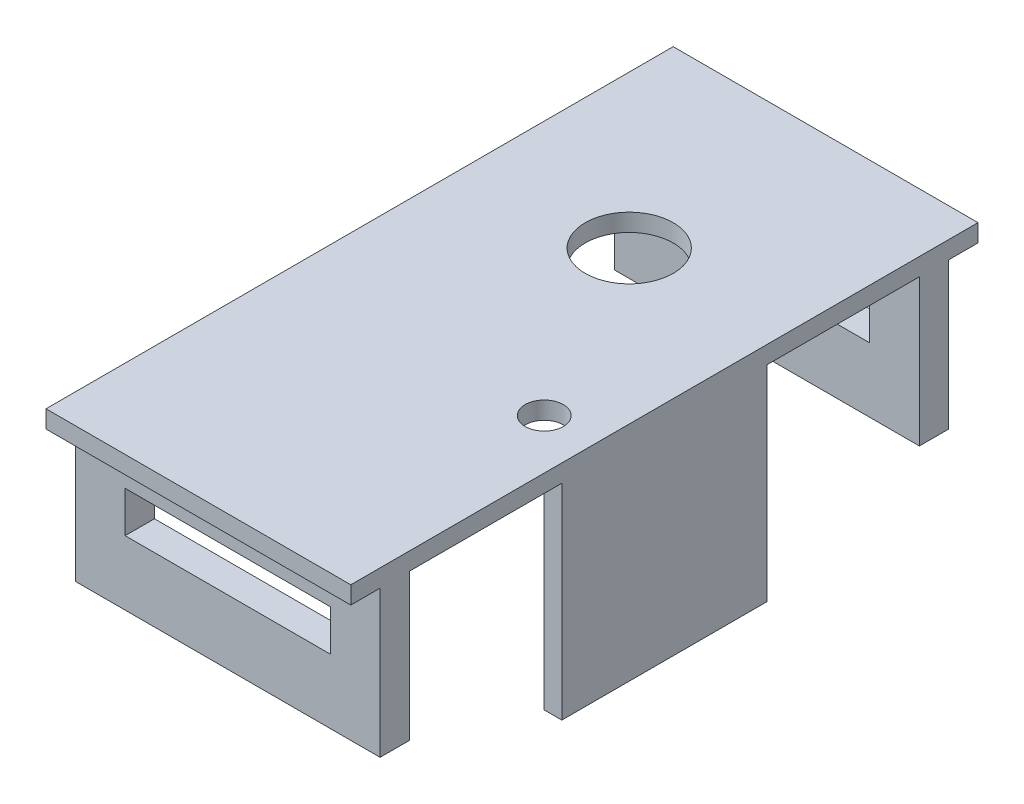
ISO-10303-21;
HEADER;
FILE_DESCRIPTION(('STEP AP214'),'2;1');
FILE_NAME('part.step','',(''),(''),'','','');
FILE_SCHEMA(('AUTOMOTIVE_DESIGN { 1 0 10303 214 1 1 1 1 }'));
ENDSEC;
DATA;
#1=APPLICATION_CONTEXT('core data for automotive mechanical design processes');
#2=APPLICATION_PROTOCOL_DEFINITION('international standard','automotive_design',2000,#1);
#3=PRODUCT_CONTEXT('',#1,'mechanical');
#4=PRODUCT('Part','Part','',(#3));
#5=PRODUCT_RELATED_PRODUCT_CATEGORY('part','',(#4));
#6=PRODUCT_DEFINITION_FORMATION('','',#4);
#7=PRODUCT_DEFINITION_CONTEXT('part definition',#1,'design');
#8=PRODUCT_DEFINITION('design','',#6,#7);
#9=PRODUCT_DEFINITION_SHAPE('','',#8);
#10=(LENGTH_UNIT() NAMED_UNIT(*) SI_UNIT(.MILLI.,.METRE.));
#11=(NAMED_UNIT(*) PLANE_ANGLE_UNIT() SI_UNIT($,.RADIAN.));
#12=(NAMED_UNIT(*) SI_UNIT($,.STERADIAN.) SOLID_ANGLE_UNIT());
#13=UNCERTAINTY_MEASURE_WITH_UNIT(LENGTH_MEASURE(1.E-05),#10,'distance_accuracy_value','');
#14=(GEOMETRIC_REPRESENTATION_CONTEXT(3) GLOBAL_UNCERTAINTY_ASSIGNED_CONTEXT((#13)) GLOBAL_UNIT_ASSIGNED_CONTEXT((#10,
#11,#12)) REPRESENTATION_CONTEXT('',''));
#15=CARTESIAN_POINT('',(0.,0.,0.));
#16=DIRECTION('',(0.,0.,1.));
#17=DIRECTION('',(1.,0.,0.));
#18=AXIS2_PLACEMENT_3D('',#15,#16,#17);
#19=CARTESIAN_POINT('',(0.,0.,0.));
#20=DIRECTION('',(0.,1.,0.));
#21=DIRECTION('',(0.,0.,1.));
#22=AXIS2_PLACEMENT_3D('',#19,#20,#21);
#23=PLANE('',#22);
#24=CARTESIAN_POINT('',(0.,0.,-20.));
#25=DIRECTION('',(0.,1.,0.));
#26=DIRECTION('',(0.,0.,1.));
#27=AXIS2_PLACEMENT_3D('',#24,#25,#26);
#28=CIRCLE('',#27,7.5);
#29=CARTESIAN_POINT('',(0.,0.,-12.5));
#30=VERTEX_POINT('',#29);
#31=EDGE_CURVE('E278',#30,#30,#28,.T.);
#32=ORIENTED_EDGE('',*,*,#31,.T.);
#33=EDGE_LOOP('',(#32));
#34=FACE_BOUND('',#33,.T.);
#35=CARTESIAN_POINT('',(17.5,0.,12.));
#36=DIRECTION('',(0.,1.,0.));
#37=DIRECTION('',(0.,0.,1.));
#38=AXIS2_PLACEMENT_3D('',#35,#36,#37);
#39=CIRCLE('',#38,3.25);
#40=CARTESIAN_POINT('',(17.5,0.,15.25));
#41=VERTEX_POINT('',#40);
#42=EDGE_CURVE('E427',#41,#41,#39,.T.);
#43=ORIENTED_EDGE('',*,*,#42,.T.);
#44=EDGE_LOOP('',(#43));
#45=FACE_BOUND('',#44,.T.);
#46=DIRECTION('',(-1.,0.,0.));
#47=VECTOR('',#46,1.);
#48=CARTESIAN_POINT('',(26.,0.,-43.5));
#49=LINE('',#48,#47);
#50=CARTESIAN_POINT('',(26.,0.,-43.5));
#51=VERTEX_POINT('',#50);
#52=CARTESIAN_POINT('',(-26.,0.,-43.5));
#53=VERTEX_POINT('',#52);
#54=EDGE_CURVE('E282',#51,#53,#49,.T.);
#55=ORIENTED_EDGE('',*,*,#54,.F.);
#56=DIRECTION('',(0.,0.,-1.));
#57=VECTOR('',#56,1.);
#58=CARTESIAN_POINT('',(26.,0.,53.5));
#59=LINE('',#58,#57);
#60=CARTESIAN_POINT('',(26.,0.,-17.5));
#61=VERTEX_POINT('',#60);
#62=EDGE_CURVE('E466',#61,#51,#59,.T.);
#63=ORIENTED_EDGE('',*,*,#62,.F.);
#64=DIRECTION('',(1.,0.,0.));
#65=VECTOR('',#64,1.);
#66=CARTESIAN_POINT('',(26.,0.,-17.5));
#67=LINE('',#66,#65);
#68=CARTESIAN_POINT('',(23.,0.,-17.5));
#69=VERTEX_POINT('',#68);
#70=EDGE_CURVE('E354',#69,#61,#67,.T.);
#71=ORIENTED_EDGE('',*,*,#70,.F.);
#72=DIRECTION('',(0.,0.,-1.));
#73=VECTOR('',#72,1.);
#74=CARTESIAN_POINT('',(23.,0.,17.5));
#75=LINE('',#74,#73);
#76=CARTESIAN_POINT('',(23.,0.,17.5));
#77=VERTEX_POINT('',#76);
#78=EDGE_CURVE('E366',#77,#69,#75,.T.);
#79=ORIENTED_EDGE('',*,*,#78,.F.);
#80=DIRECTION('',(-1.,0.,0.));
#81=VECTOR('',#80,1.);
#82=CARTESIAN_POINT('',(26.,0.,17.5));
#83=LINE('',#82,#81);
#84=CARTESIAN_POINT('',(26.,0.,17.5));
#85=VERTEX_POINT('',#84);
#86=EDGE_CURVE('E348',#85,#77,#83,.T.);
#87=ORIENTED_EDGE('',*,*,#86,.F.);
#88=CARTESIAN_POINT('',(26.,0.,43.5));
#89=VERTEX_POINT('',#88);
#90=EDGE_CURVE('E465',#89,#85,#59,.T.);
#91=ORIENTED_EDGE('',*,*,#90,.F.);
#92=DIRECTION('',(1.,0.,0.));
#93=VECTOR('',#92,1.);
#94=CARTESIAN_POINT('',(-26.,0.,43.5));
#95=LINE('',#94,#93);
#96=CARTESIAN_POINT('',(-26.,0.,43.5));
#97=VERTEX_POINT('',#96);
#98=EDGE_CURVE('E315',#97,#89,#95,.T.);
#99=ORIENTED_EDGE('',*,*,#98,.F.);
#100=DIRECTION('',(0.,0.,1.));
#101=VECTOR('',#100,1.);
#102=CARTESIAN_POINT('',(-26.,0.,53.5));
#103=LINE('',#102,#101);
#104=CARTESIAN_POINT('',(-26.,0.,17.5));
#105=VERTEX_POINT('',#104);
#106=EDGE_CURVE('E457',#105,#97,#103,.T.);
#107=ORIENTED_EDGE('',*,*,#106,.F.);
#108=DIRECTION('',(-1.,0.,0.));
#109=VECTOR('',#108,1.);
#110=CARTESIAN_POINT('',(-26.,0.,17.5));
#111=LINE('',#110,#109);
#112=CARTESIAN_POINT('',(-23.,0.,17.5));
#113=VERTEX_POINT('',#112);
#114=EDGE_CURVE('E392',#113,#105,#111,.T.);
#115=ORIENTED_EDGE('',*,*,#114,.F.);
#116=DIRECTION('',(0.,0.,1.));
#117=VECTOR('',#116,1.);
#118=CARTESIAN_POINT('',(-23.,0.,17.5));
#119=LINE('',#118,#117);
#120=CARTESIAN_POINT('',(-23.,0.,-17.5));
#121=VERTEX_POINT('',#120);
#122=EDGE_CURVE('E405',#121,#113,#119,.T.);
#123=ORIENTED_EDGE('',*,*,#122,.F.);
#124=DIRECTION('',(1.,0.,0.));
#125=VECTOR('',#124,1.);
#126=CARTESIAN_POINT('',(-26.,0.,-17.5));
#127=LINE('',#126,#125);
#128=CARTESIAN_POINT('',(-26.,0.,-17.5));
#129=VERTEX_POINT('',#128);
#130=EDGE_CURVE('E386',#129,#121,#127,.T.);
#131=ORIENTED_EDGE('',*,*,#130,.F.);
#132=EDGE_CURVE('E456',#53,#129,#103,.T.);
#133=ORIENTED_EDGE('',*,*,#132,.F.);
#134=EDGE_LOOP('',(#55,#63,#71,#79,#87,#91,#99,#107,#115,#123,#131,#133));
#135=FACE_BOUND('',#134,.T.);
#136=ADVANCED_FACE('F39',(#34,#45,#135),#23,.F.);
#137=DIRECTION('',(1.,0.,0.));
#138=VECTOR('',#137,1.);
#139=CARTESIAN_POINT('',(26.,0.,-48.5));
#140=LINE('',#139,#138);
#141=CARTESIAN_POINT('',(-26.,0.,-48.5));
#142=VERTEX_POINT('',#141);
#143=CARTESIAN_POINT('',(26.,0.,-48.5));
#144=VERTEX_POINT('',#143);
#145=EDGE_CURVE('E288',#142,#144,#140,.T.);
#146=ORIENTED_EDGE('',*,*,#145,.F.);
#147=CARTESIAN_POINT('',(-26.,0.,-53.5));
#148=VERTEX_POINT('',#147);
#149=EDGE_CURVE('E451',#148,#142,#103,.T.);
#150=ORIENTED_EDGE('',*,*,#149,.F.);
#151=DIRECTION('',(-1.,0.,0.));
#152=VECTOR('',#151,1.);
#153=CARTESIAN_POINT('',(26.,0.,-53.5));
#154=LINE('',#153,#152);
#155=CARTESIAN_POINT('',(26.,0.,-53.5));
#156=VERTEX_POINT('',#155);
#157=EDGE_CURVE('E441',#156,#148,#154,.T.);
#158=ORIENTED_EDGE('',*,*,#157,.F.);
#159=EDGE_CURVE('E460',#144,#156,#59,.T.);
#160=ORIENTED_EDGE('',*,*,#159,.F.);
#161=EDGE_LOOP('',(#146,#150,#158,#160));
#162=FACE_BOUND('',#161,.T.);
#163=ADVANCED_FACE('F551',(#162),#23,.F.);
#164=DIRECTION('',(-1.,0.,0.));
#165=VECTOR('',#164,1.);
#166=CARTESIAN_POINT('',(-26.,0.,48.5));
#167=LINE('',#166,#165);
#168=CARTESIAN_POINT('',(26.,0.,48.5));
#169=VERTEX_POINT('',#168);
#170=CARTESIAN_POINT('',(-26.,0.,48.5));
#171=VERTEX_POINT('',#170);
#172=EDGE_CURVE('E321',#169,#171,#167,.T.);
#173=ORIENTED_EDGE('',*,*,#172,.F.);
#174=CARTESIAN_POINT('',(26.,0.,53.5));
#175=VERTEX_POINT('',#174);
#176=EDGE_CURVE('E461',#175,#169,#59,.T.);
#177=ORIENTED_EDGE('',*,*,#176,.F.);
#178=DIRECTION('',(1.,0.,0.));
#179=VECTOR('',#178,1.);
#180=CARTESIAN_POINT('',(26.,0.,53.5));
#181=LINE('',#180,#179);
#182=CARTESIAN_POINT('',(-26.,0.,53.5));
#183=VERTEX_POINT('',#182);
#184=EDGE_CURVE('E455',#183,#175,#181,.T.);
#185=ORIENTED_EDGE('',*,*,#184,.F.);
#186=EDGE_CURVE('E432',#171,#183,#103,.T.);
#187=ORIENTED_EDGE('',*,*,#186,.F.);
#188=EDGE_LOOP('',(#173,#177,#185,#187));
#189=FACE_BOUND('',#188,.T.);
#190=ADVANCED_FACE('F554',(#189),#23,.F.);
#191=CARTESIAN_POINT('',(0.,3.,0.));
#192=DIRECTION('',(0.,1.,0.));
#193=DIRECTION('',(0.,0.,1.));
#194=AXIS2_PLACEMENT_3D('',#191,#192,#193);
#195=PLANE('',#194);
#196=CARTESIAN_POINT('',(0.,3.,-20.));
#197=DIRECTION('',(0.,1.,0.));
#198=DIRECTION('',(0.,0.,1.));
#199=AXIS2_PLACEMENT_3D('',#196,#197,#198);
#200=CIRCLE('',#199,7.5);
#201=CARTESIAN_POINT('',(0.,3.,-12.5));
#202=VERTEX_POINT('',#201);
#203=EDGE_CURVE('E274',#202,#202,#200,.T.);
#204=ORIENTED_EDGE('',*,*,#203,.F.);
#205=EDGE_LOOP('',(#204));
#206=FACE_BOUND('',#205,.T.);
#207=DIRECTION('',(0.,0.,1.));
#208=VECTOR('',#207,1.);
#209=CARTESIAN_POINT('',(-26.,3.,53.5));
#210=LINE('',#209,#208);
#211=CARTESIAN_POINT('',(-26.,3.,-53.5));
#212=VERTEX_POINT('',#211);
#213=CARTESIAN_POINT('',(-26.,3.,53.5));
#214=VERTEX_POINT('',#213);
#215=EDGE_CURVE('E436',#212,#214,#210,.T.);
#216=ORIENTED_EDGE('',*,*,#215,.T.);
#217=DIRECTION('',(1.,0.,0.));
#218=VECTOR('',#217,1.);
#219=CARTESIAN_POINT('',(26.,3.,53.5));
#220=LINE('',#219,#218);
#221=CARTESIAN_POINT('',(26.,3.,53.5));
#222=VERTEX_POINT('',#221);
#223=EDGE_CURVE('E440',#214,#222,#220,.T.);
#224=ORIENTED_EDGE('',*,*,#223,.T.);
#225=DIRECTION('',(0.,0.,-1.));
#226=VECTOR('',#225,1.);
#227=CARTESIAN_POINT('',(26.,3.,53.5));
#228=LINE('',#227,#226);
#229=CARTESIAN_POINT('',(26.,3.,-53.5));
#230=VERTEX_POINT('',#229);
#231=EDGE_CURVE('E444',#222,#230,#228,.T.);
#232=ORIENTED_EDGE('',*,*,#231,.T.);
#233=DIRECTION('',(-1.,0.,0.));
#234=VECTOR('',#233,1.);
#235=CARTESIAN_POINT('',(26.,3.,-53.5));
#236=LINE('',#235,#234);
#237=EDGE_CURVE('E447',#230,#212,#236,.T.);
#238=ORIENTED_EDGE('',*,*,#237,.T.);
#239=EDGE_LOOP('',(#216,#224,#232,#238));
#240=FACE_BOUND('',#239,.T.);
#241=CARTESIAN_POINT('',(17.5,3.,12.));
#242=DIRECTION('',(0.,1.,0.));
#243=DIRECTION('',(0.,0.,1.));
#244=AXIS2_PLACEMENT_3D('',#241,#242,#243);
#245=CIRCLE('',#244,3.25);
#246=CARTESIAN_POINT('',(17.5,3.,15.25));
#247=VERTEX_POINT('',#246);
#248=EDGE_CURVE('E428',#247,#247,#245,.T.);
#249=ORIENTED_EDGE('',*,*,#248,.F.);
#250=EDGE_LOOP('',(#249));
#251=FACE_BOUND('',#250,.T.);
#252=ADVANCED_FACE('F563',(#206,#240,#251),#195,.T.);
#253=CARTESIAN_POINT('',(-26.,3.,53.5));
#254=DIRECTION('',(1.,0.,0.));
#255=DIRECTION('',(0.,0.,-1.));
#256=AXIS2_PLACEMENT_3D('',#253,#254,#255);
#257=PLANE('',#256);
#258=ORIENTED_EDGE('',*,*,#149,.T.);
#259=DIRECTION('',(0.,1.,0.));
#260=VECTOR('',#259,1.);
#261=CARTESIAN_POINT('',(-26.,-25.,-48.5));
#262=LINE('',#261,#260);
#263=CARTESIAN_POINT('',(-26.,-25.,-48.5));
#264=VERTEX_POINT('',#263);
#265=EDGE_CURVE('E305',#264,#142,#262,.T.);
#266=ORIENTED_EDGE('',*,*,#265,.F.);
#267=DIRECTION('',(0.,0.,-1.));
#268=VECTOR('',#267,1.);
#269=CARTESIAN_POINT('',(-26.,-25.,-43.5));
#270=LINE('',#269,#268);
#271=CARTESIAN_POINT('',(-26.,-25.,-43.5));
#272=VERTEX_POINT('',#271);
#273=EDGE_CURVE('E291',#272,#264,#270,.T.);
#274=ORIENTED_EDGE('',*,*,#273,.F.);
#275=DIRECTION('',(0.,1.,0.));
#276=VECTOR('',#275,1.);
#277=CARTESIAN_POINT('',(-26.,-25.,-43.5));
#278=LINE('',#277,#276);
#279=EDGE_CURVE('E308',#272,#53,#278,.T.);
#280=ORIENTED_EDGE('',*,*,#279,.T.);
#281=ORIENTED_EDGE('',*,*,#132,.T.);
#282=DIRECTION('',(0.,1.,0.));
#283=VECTOR('',#282,1.);
#284=CARTESIAN_POINT('',(-26.,-35.,-17.5));
#285=LINE('',#284,#283);
#286=CARTESIAN_POINT('',(-26.,-35.,-17.5));
#287=VERTEX_POINT('',#286);
#288=EDGE_CURVE('E423',#287,#129,#285,.T.);
#289=ORIENTED_EDGE('',*,*,#288,.F.);
#290=DIRECTION('',(0.,0.,-1.));
#291=VECTOR('',#290,1.);
#292=CARTESIAN_POINT('',(-26.,-35.,17.5));
#293=LINE('',#292,#291);
#294=CARTESIAN_POINT('',(-26.,-35.,17.5));
#295=VERTEX_POINT('',#294);
#296=EDGE_CURVE('E387',#295,#287,#293,.T.);
#297=ORIENTED_EDGE('',*,*,#296,.F.);
#298=DIRECTION('',(0.,1.,0.));
#299=VECTOR('',#298,1.);
#300=CARTESIAN_POINT('',(-26.,-35.,17.5));
#301=LINE('',#300,#299);
#302=EDGE_CURVE('E401',#295,#105,#301,.T.);
#303=ORIENTED_EDGE('',*,*,#302,.T.);
#304=ORIENTED_EDGE('',*,*,#106,.T.);
#305=DIRECTION('',(0.,1.,0.));
#306=VECTOR('',#305,1.);
#307=CARTESIAN_POINT('',(-26.,-25.,43.5));
#308=LINE('',#307,#306);
#309=CARTESIAN_POINT('',(-26.,-25.,43.5));
#310=VERTEX_POINT('',#309);
#311=EDGE_CURVE('E345',#310,#97,#308,.T.);
#312=ORIENTED_EDGE('',*,*,#311,.F.);
#313=DIRECTION('',(0.,0.,-1.));
#314=VECTOR('',#313,1.);
#315=CARTESIAN_POINT('',(-26.,-25.,48.5));
#316=LINE('',#315,#314);
#317=CARTESIAN_POINT('',(-26.,-25.,48.5));
#318=VERTEX_POINT('',#317);
#319=EDGE_CURVE('E316',#318,#310,#316,.T.);
#320=ORIENTED_EDGE('',*,*,#319,.F.);
#321=DIRECTION('',(0.,1.,0.));
#322=VECTOR('',#321,1.);
#323=CARTESIAN_POINT('',(-26.,-25.,48.5));
#324=LINE('',#323,#322);
#325=EDGE_CURVE('E330',#318,#171,#324,.T.);
#326=ORIENTED_EDGE('',*,*,#325,.T.);
#327=ORIENTED_EDGE('',*,*,#186,.T.);
#328=DIRECTION('',(0.,-1.,0.));
#329=VECTOR('',#328,1.);
#330=CARTESIAN_POINT('',(-26.,3.,53.5));
#331=LINE('',#330,#329);
#332=EDGE_CURVE('E480',#214,#183,#331,.T.);
#333=ORIENTED_EDGE('',*,*,#332,.F.);
#334=ORIENTED_EDGE('',*,*,#215,.F.);
#335=DIRECTION('',(0.,-1.,0.));
#336=VECTOR('',#335,1.);
#337=CARTESIAN_POINT('',(-26.,3.,-53.5));
#338=LINE('',#337,#336);
#339=EDGE_CURVE('E450',#212,#148,#338,.T.);
#340=ORIENTED_EDGE('',*,*,#339,.T.);
#341=EDGE_LOOP('',(#258,#266,#274,#280,#281,#289,#297,#303,#304,#312,#320,#326,#327,#333,#334,#340));
#342=FACE_BOUND('',#341,.T.);
#343=ADVANCED_FACE('F41',(#342),#257,.F.);
#344=CARTESIAN_POINT('',(26.,3.,53.5));
#345=DIRECTION('',(0.,0.,-1.));
#346=DIRECTION('',(-1.,0.,0.));
#347=AXIS2_PLACEMENT_3D('',#344,#345,#346);
#348=PLANE('',#347);
#349=ORIENTED_EDGE('',*,*,#184,.T.);
#350=DIRECTION('',(0.,-1.,0.));
#351=VECTOR('',#350,1.);
#352=CARTESIAN_POINT('',(26.,3.,53.5));
#353=LINE('',#352,#351);
#354=EDGE_CURVE('E476',#222,#175,#353,.T.);
#355=ORIENTED_EDGE('',*,*,#354,.F.);
#356=ORIENTED_EDGE('',*,*,#223,.F.);
#357=ORIENTED_EDGE('',*,*,#332,.T.);
#358=EDGE_LOOP('',(#349,#355,#356,#357));
#359=FACE_BOUND('',#358,.T.);
#360=ADVANCED_FACE('F584',(#359),#348,.F.);
#361=CARTESIAN_POINT('',(26.,3.,53.5));
#362=DIRECTION('',(-1.,0.,0.));
#363=DIRECTION('',(0.,0.,1.));
#364=AXIS2_PLACEMENT_3D('',#361,#362,#363);
#365=PLANE('',#364);
#366=ORIENTED_EDGE('',*,*,#176,.T.);
#367=DIRECTION('',(0.,1.,0.));
#368=VECTOR('',#367,1.);
#369=CARTESIAN_POINT('',(26.,-25.,48.5));
#370=LINE('',#369,#368);
#371=CARTESIAN_POINT('',(26.,-25.,48.5));
#372=VERTEX_POINT('',#371);
#373=EDGE_CURVE('E339',#372,#169,#370,.T.);
#374=ORIENTED_EDGE('',*,*,#373,.F.);
#375=DIRECTION('',(0.,0.,1.));
#376=VECTOR('',#375,1.);
#377=CARTESIAN_POINT('',(26.,-25.,48.5));
#378=LINE('',#377,#376);
#379=CARTESIAN_POINT('',(26.,-25.,43.5));
#380=VERTEX_POINT('',#379);
#381=EDGE_CURVE('E324',#380,#372,#378,.T.);
#382=ORIENTED_EDGE('',*,*,#381,.F.);
#383=DIRECTION('',(0.,1.,0.));
#384=VECTOR('',#383,1.);
#385=CARTESIAN_POINT('',(26.,-25.,43.5));
#386=LINE('',#385,#384);
#387=EDGE_CURVE('E342',#380,#89,#386,.T.);
#388=ORIENTED_EDGE('',*,*,#387,.T.);
#389=ORIENTED_EDGE('',*,*,#90,.T.);
#390=DIRECTION('',(0.,1.,0.));
#391=VECTOR('',#390,1.);
#392=CARTESIAN_POINT('',(26.,-35.,17.5));
#393=LINE('',#392,#391);
#394=CARTESIAN_POINT('',(26.,-35.,17.5));
#395=VERTEX_POINT('',#394);
#396=EDGE_CURVE('E382',#395,#85,#393,.T.);
#397=ORIENTED_EDGE('',*,*,#396,.F.);
#398=DIRECTION('',(0.,0.,1.));
#399=VECTOR('',#398,1.);
#400=CARTESIAN_POINT('',(26.,-35.,17.5));
#401=LINE('',#400,#399);
#402=CARTESIAN_POINT('',(26.,-35.,-17.5));
#403=VERTEX_POINT('',#402);
#404=EDGE_CURVE('E349',#403,#395,#401,.T.);
#405=ORIENTED_EDGE('',*,*,#404,.F.);
#406=DIRECTION('',(0.,1.,0.));
#407=VECTOR('',#406,1.);
#408=CARTESIAN_POINT('',(26.,-35.,-17.5));
#409=LINE('',#408,#407);
#410=EDGE_CURVE('E363',#403,#61,#409,.T.);
#411=ORIENTED_EDGE('',*,*,#410,.T.);
#412=ORIENTED_EDGE('',*,*,#62,.T.);
#413=DIRECTION('',(0.,1.,0.));
#414=VECTOR('',#413,1.);
#415=CARTESIAN_POINT('',(26.,-25.,-43.5));
#416=LINE('',#415,#414);
#417=CARTESIAN_POINT('',(26.,-25.,-43.5));
#418=VERTEX_POINT('',#417);
#419=EDGE_CURVE('E312',#418,#51,#416,.T.);
#420=ORIENTED_EDGE('',*,*,#419,.F.);
#421=DIRECTION('',(0.,0.,1.));
#422=VECTOR('',#421,1.);
#423=CARTESIAN_POINT('',(26.,-25.,-43.5));
#424=LINE('',#423,#422);
#425=CARTESIAN_POINT('',(26.,-25.,-48.5));
#426=VERTEX_POINT('',#425);
#427=EDGE_CURVE('E283',#426,#418,#424,.T.);
#428=ORIENTED_EDGE('',*,*,#427,.F.);
#429=DIRECTION('',(0.,1.,0.));
#430=VECTOR('',#429,1.);
#431=CARTESIAN_POINT('',(26.,-25.,-48.5));
#432=LINE('',#431,#430);
#433=EDGE_CURVE('E297',#426,#144,#432,.T.);
#434=ORIENTED_EDGE('',*,*,#433,.T.);
#435=ORIENTED_EDGE('',*,*,#159,.T.);
#436=DIRECTION('',(0.,-1.,0.));
#437=VECTOR('',#436,1.);
#438=CARTESIAN_POINT('',(26.,3.,-53.5));
#439=LINE('',#438,#437);
#440=EDGE_CURVE('E472',#230,#156,#439,.T.);
#441=ORIENTED_EDGE('',*,*,#440,.F.);
#442=ORIENTED_EDGE('',*,*,#231,.F.);
#443=ORIENTED_EDGE('',*,*,#354,.T.);
#444=EDGE_LOOP('',(#366,#374,#382,#388,#389,#397,#405,#411,#412,#420,#428,#434,#435,#441,#442,#443));
#445=FACE_BOUND('',#444,.T.);
#446=ADVANCED_FACE('F577',(#445),#365,.F.);
#447=CARTESIAN_POINT('',(26.,3.,-53.5));
#448=DIRECTION('',(0.,0.,1.));
#449=DIRECTION('',(1.,0.,0.));
#450=AXIS2_PLACEMENT_3D('',#447,#448,#449);
#451=PLANE('',#450);
#452=ORIENTED_EDGE('',*,*,#157,.T.);
#453=ORIENTED_EDGE('',*,*,#339,.F.);
#454=ORIENTED_EDGE('',*,*,#237,.F.);
#455=ORIENTED_EDGE('',*,*,#440,.T.);
#456=EDGE_LOOP('',(#452,#453,#454,#455));
#457=FACE_BOUND('',#456,.T.);
#458=ADVANCED_FACE('F628',(#457),#451,.F.);
#459=CARTESIAN_POINT('',(17.5,3.,12.));
#460=DIRECTION('',(0.,-1.,0.));
#461=DIRECTION('',(0.,0.,-1.));
#462=AXIS2_PLACEMENT_3D('',#459,#460,#461);
#463=CYLINDRICAL_SURFACE('',#462,3.25);
#464=ORIENTED_EDGE('',*,*,#248,.T.);
#465=EDGE_LOOP('',(#464));
#466=FACE_BOUND('',#465,.T.);
#467=ORIENTED_EDGE('',*,*,#42,.F.);
#468=EDGE_LOOP('',(#467));
#469=FACE_BOUND('',#468,.T.);
#470=ADVANCED_FACE('F623',(#466,#469),#463,.F.);
#471=CARTESIAN_POINT('',(-26.,-35.,-17.5));
#472=DIRECTION('',(0.,0.,1.));
#473=DIRECTION('',(1.,0.,0.));
#474=AXIS2_PLACEMENT_3D('',#471,#472,#473);
#475=PLANE('',#474);
#476=ORIENTED_EDGE('',*,*,#130,.T.);
#477=DIRECTION('',(0.,1.,0.));
#478=VECTOR('',#477,1.);
#479=CARTESIAN_POINT('',(-23.,-35.,-17.5));
#480=LINE('',#479,#478);
#481=CARTESIAN_POINT('',(-23.,-35.,-17.5));
#482=VERTEX_POINT('',#481);
#483=EDGE_CURVE('E419',#482,#121,#480,.T.);
#484=ORIENTED_EDGE('',*,*,#483,.F.);
#485=DIRECTION('',(1.,0.,0.));
#486=VECTOR('',#485,1.);
#487=CARTESIAN_POINT('',(-26.,-35.,-17.5));
#488=LINE('',#487,#486);
#489=EDGE_CURVE('E391',#287,#482,#488,.T.);
#490=ORIENTED_EDGE('',*,*,#489,.F.);
#491=ORIENTED_EDGE('',*,*,#288,.T.);
#492=EDGE_LOOP('',(#476,#484,#490,#491));
#493=FACE_BOUND('',#492,.T.);
#494=ADVANCED_FACE('F603',(#493),#475,.F.);
#495=CARTESIAN_POINT('',(-23.,-35.,17.5));
#496=DIRECTION('',(-1.,0.,0.));
#497=DIRECTION('',(0.,0.,1.));
#498=AXIS2_PLACEMENT_3D('',#495,#496,#497);
#499=PLANE('',#498);
#500=ORIENTED_EDGE('',*,*,#122,.T.);
#501=DIRECTION('',(0.,1.,0.));
#502=VECTOR('',#501,1.);
#503=CARTESIAN_POINT('',(-23.,-35.,17.5));
#504=LINE('',#503,#502);
#505=CARTESIAN_POINT('',(-23.,-35.,17.5));
#506=VERTEX_POINT('',#505);
#507=EDGE_CURVE('E415',#506,#113,#504,.T.);
#508=ORIENTED_EDGE('',*,*,#507,.F.);
#509=DIRECTION('',(0.,0.,1.));
#510=VECTOR('',#509,1.);
#511=CARTESIAN_POINT('',(-23.,-35.,17.5));
#512=LINE('',#511,#510);
#513=EDGE_CURVE('E395',#482,#506,#512,.T.);
#514=ORIENTED_EDGE('',*,*,#513,.F.);
#515=ORIENTED_EDGE('',*,*,#483,.T.);
#516=EDGE_LOOP('',(#500,#508,#514,#515));
#517=FACE_BOUND('',#516,.T.);
#518=ADVANCED_FACE('F615',(#517),#499,.F.);
#519=CARTESIAN_POINT('',(-26.,-35.,17.5));
#520=DIRECTION('',(0.,0.,-1.));
#521=DIRECTION('',(-1.,0.,0.));
#522=AXIS2_PLACEMENT_3D('',#519,#520,#521);
#523=PLANE('',#522);
#524=ORIENTED_EDGE('',*,*,#114,.T.);
#525=ORIENTED_EDGE('',*,*,#302,.F.);
#526=DIRECTION('',(-1.,0.,0.));
#527=VECTOR('',#526,1.);
#528=CARTESIAN_POINT('',(-26.,-35.,17.5));
#529=LINE('',#528,#527);
#530=EDGE_CURVE('E398',#506,#295,#529,.T.);
#531=ORIENTED_EDGE('',*,*,#530,.F.);
#532=ORIENTED_EDGE('',*,*,#507,.T.);
#533=EDGE_LOOP('',(#524,#525,#531,#532));
#534=FACE_BOUND('',#533,.T.);
#535=ADVANCED_FACE('F611',(#534),#523,.F.);
#536=CARTESIAN_POINT('',(0.,-35.,0.));
#537=DIRECTION('',(0.,-1.,0.));
#538=DIRECTION('',(0.,0.,-1.));
#539=AXIS2_PLACEMENT_3D('',#536,#537,#538);
#540=PLANE('',#539);
#541=ORIENTED_EDGE('',*,*,#296,.T.);
#542=ORIENTED_EDGE('',*,*,#489,.T.);
#543=ORIENTED_EDGE('',*,*,#513,.T.);
#544=ORIENTED_EDGE('',*,*,#530,.T.);
#545=EDGE_LOOP('',(#541,#542,#543,#544));
#546=FACE_BOUND('',#545,.T.);
#547=ADVANCED_FACE('F606',(#546),#540,.T.);
#548=CARTESIAN_POINT('',(26.,-35.,17.5));
#549=DIRECTION('',(0.,0.,-1.));
#550=DIRECTION('',(-1.,0.,0.));
#551=AXIS2_PLACEMENT_3D('',#548,#549,#550);
#552=PLANE('',#551);
#553=ORIENTED_EDGE('',*,*,#86,.T.);
#554=DIRECTION('',(0.,1.,0.));
#555=VECTOR('',#554,1.);
#556=CARTESIAN_POINT('',(23.,-35.,17.5));
#557=LINE('',#556,#555);
#558=CARTESIAN_POINT('',(23.,-35.,17.5));
#559=VERTEX_POINT('',#558);
#560=EDGE_CURVE('E378',#559,#77,#557,.T.);
#561=ORIENTED_EDGE('',*,*,#560,.F.);
#562=DIRECTION('',(-1.,0.,0.));
#563=VECTOR('',#562,1.);
#564=CARTESIAN_POINT('',(26.,-35.,17.5));
#565=LINE('',#564,#563);
#566=EDGE_CURVE('E353',#395,#559,#565,.T.);
#567=ORIENTED_EDGE('',*,*,#566,.F.);
#568=ORIENTED_EDGE('',*,*,#396,.T.);
#569=EDGE_LOOP('',(#553,#561,#567,#568));
#570=FACE_BOUND('',#569,.T.);
#571=ADVANCED_FACE('F781',(#570),#552,.F.);
#572=CARTESIAN_POINT('',(23.,-35.,17.5));
#573=DIRECTION('',(1.,0.,0.));
#574=DIRECTION('',(0.,0.,-1.));
#575=AXIS2_PLACEMENT_3D('',#572,#573,#574);
#576=PLANE('',#575);
#577=ORIENTED_EDGE('',*,*,#78,.T.);
#578=DIRECTION('',(0.,1.,0.));
#579=VECTOR('',#578,1.);
#580=CARTESIAN_POINT('',(23.,-35.,-17.5));
#581=LINE('',#580,#579);
#582=CARTESIAN_POINT('',(23.,-35.,-17.5));
#583=VERTEX_POINT('',#582);
#584=EDGE_CURVE('E374',#583,#69,#581,.T.);
#585=ORIENTED_EDGE('',*,*,#584,.F.);
#586=DIRECTION('',(0.,0.,-1.));
#587=VECTOR('',#586,1.);
#588=CARTESIAN_POINT('',(23.,-35.,17.5));
#589=LINE('',#588,#587);
#590=EDGE_CURVE('E357',#559,#583,#589,.T.);
#591=ORIENTED_EDGE('',*,*,#590,.F.);
#592=ORIENTED_EDGE('',*,*,#560,.T.);
#593=EDGE_LOOP('',(#577,#585,#591,#592));
#594=FACE_BOUND('',#593,.T.);
#595=ADVANCED_FACE('F777',(#594),#576,.F.);
#596=CARTESIAN_POINT('',(26.,-35.,-17.5));
#597=DIRECTION('',(0.,0.,1.));
#598=DIRECTION('',(1.,0.,0.));
#599=AXIS2_PLACEMENT_3D('',#596,#597,#598);
#600=PLANE('',#599);
#601=ORIENTED_EDGE('',*,*,#70,.T.);
#602=ORIENTED_EDGE('',*,*,#410,.F.);
#603=DIRECTION('',(1.,0.,0.));
#604=VECTOR('',#603,1.);
#605=CARTESIAN_POINT('',(26.,-35.,-17.5));
#606=LINE('',#605,#604);
#607=EDGE_CURVE('E360',#583,#403,#606,.T.);
#608=ORIENTED_EDGE('',*,*,#607,.F.);
#609=ORIENTED_EDGE('',*,*,#584,.T.);
#610=EDGE_LOOP('',(#601,#602,#608,#609));
#611=FACE_BOUND('',#610,.T.);
#612=ADVANCED_FACE('F773',(#611),#600,.F.);
#613=CARTESIAN_POINT('',(0.,-35.,0.));
#614=DIRECTION('',(0.,1.,0.));
#615=DIRECTION('',(0.,0.,1.));
#616=AXIS2_PLACEMENT_3D('',#613,#614,#615);
#617=PLANE('',#616);
#618=ORIENTED_EDGE('',*,*,#404,.T.);
#619=ORIENTED_EDGE('',*,*,#566,.T.);
#620=ORIENTED_EDGE('',*,*,#590,.T.);
#621=ORIENTED_EDGE('',*,*,#607,.T.);
#622=EDGE_LOOP('',(#618,#619,#620,#621));
#623=FACE_BOUND('',#622,.T.);
#624=ADVANCED_FACE('F676',(#623),#617,.F.);
#625=CARTESIAN_POINT('',(-26.,-25.,43.5));
#626=DIRECTION('',(0.,0.,1.));
#627=DIRECTION('',(1.,0.,0.));
#628=AXIS2_PLACEMENT_3D('',#625,#626,#627);
#629=PLANE('',#628);
#630=DIRECTION('',(1.,0.,0.));
#631=VECTOR('',#630,1.);
#632=CARTESIAN_POINT('',(-26.,-14.,43.5));
#633=LINE('',#632,#631);
#634=CARTESIAN_POINT('',(-17.5,-14.,43.5));
#635=VERTEX_POINT('',#634);
#636=CARTESIAN_POINT('',(17.5,-14.,43.5));
#637=VERTEX_POINT('',#636);
#638=EDGE_CURVE('E222',#635,#637,#633,.T.);
#639=ORIENTED_EDGE('',*,*,#638,.T.);
#640=DIRECTION('',(0.,1.,0.));
#641=VECTOR('',#640,1.);
#642=CARTESIAN_POINT('',(17.5,-25.,43.5));
#643=LINE('',#642,#641);
#644=CARTESIAN_POINT('',(17.5,-7.,43.5));
#645=VERTEX_POINT('',#644);
#646=EDGE_CURVE('E271',#637,#645,#643,.T.);
#647=ORIENTED_EDGE('',*,*,#646,.T.);
#648=DIRECTION('',(-1.,0.,0.));
#649=VECTOR('',#648,1.);
#650=CARTESIAN_POINT('',(-26.,-7.,43.5));
#651=LINE('',#650,#649);
#652=CARTESIAN_POINT('',(-17.5,-7.,43.5));
#653=VERTEX_POINT('',#652);
#654=EDGE_CURVE('E246',#645,#653,#651,.T.);
#655=ORIENTED_EDGE('',*,*,#654,.T.);
#656=DIRECTION('',(0.,-1.,0.));
#657=VECTOR('',#656,1.);
#658=CARTESIAN_POINT('',(-17.5,-25.,43.5));
#659=LINE('',#658,#657);
#660=EDGE_CURVE('E234',#653,#635,#659,.T.);
#661=ORIENTED_EDGE('',*,*,#660,.T.);
#662=EDGE_LOOP('',(#639,#647,#655,#661));
#663=FACE_BOUND('',#662,.T.);
#664=ORIENTED_EDGE('',*,*,#98,.T.);
#665=ORIENTED_EDGE('',*,*,#387,.F.);
#666=DIRECTION('',(1.,0.,0.));
#667=VECTOR('',#666,1.);
#668=CARTESIAN_POINT('',(-26.,-25.,43.5));
#669=LINE('',#668,#667);
#670=EDGE_CURVE('E320',#310,#380,#669,.T.);
#671=ORIENTED_EDGE('',*,*,#670,.F.);
#672=ORIENTED_EDGE('',*,*,#311,.T.);
#673=EDGE_LOOP('',(#664,#665,#671,#672));
#674=FACE_BOUND('',#673,.T.);
#675=ADVANCED_FACE('F244',(#663,#674),#629,.F.);
#676=CARTESIAN_POINT('',(-26.,-25.,48.5));
#677=DIRECTION('',(0.,0.,-1.));
#678=DIRECTION('',(-1.,0.,0.));
#679=AXIS2_PLACEMENT_3D('',#676,#677,#678);
#680=PLANE('',#679);
#681=DIRECTION('',(1.,0.,0.));
#682=VECTOR('',#681,1.);
#683=CARTESIAN_POINT('',(-26.,-7.,48.5));
#684=LINE('',#683,#682);
#685=CARTESIAN_POINT('',(-17.5,-7.,48.5));
#686=VERTEX_POINT('',#685);
#687=CARTESIAN_POINT('',(17.5,-7.,48.5));
#688=VERTEX_POINT('',#687);
#689=EDGE_CURVE('E253',#686,#688,#684,.T.);
#690=ORIENTED_EDGE('',*,*,#689,.T.);
#691=DIRECTION('',(0.,-1.,0.));
#692=VECTOR('',#691,1.);
#693=CARTESIAN_POINT('',(17.5,-25.,48.5));
#694=LINE('',#693,#692);
#695=CARTESIAN_POINT('',(17.5,-14.,48.5));
#696=VERTEX_POINT('',#695);
#697=EDGE_CURVE('E267',#688,#696,#694,.T.);
#698=ORIENTED_EDGE('',*,*,#697,.T.);
#699=DIRECTION('',(-1.,0.,0.));
#700=VECTOR('',#699,1.);
#701=CARTESIAN_POINT('',(-26.,-14.,48.5));
#702=LINE('',#701,#700);
#703=CARTESIAN_POINT('',(-17.5,-14.,48.5));
#704=VERTEX_POINT('',#703);
#705=EDGE_CURVE('E229',#696,#704,#702,.T.);
#706=ORIENTED_EDGE('',*,*,#705,.T.);
#707=DIRECTION('',(0.,1.,0.));
#708=VECTOR('',#707,1.);
#709=CARTESIAN_POINT('',(-17.5,-25.,48.5));
#710=LINE('',#709,#708);
#711=EDGE_CURVE('E237',#704,#686,#710,.T.);
#712=ORIENTED_EDGE('',*,*,#711,.T.);
#713=EDGE_LOOP('',(#690,#698,#706,#712));
#714=FACE_BOUND('',#713,.T.);
#715=ORIENTED_EDGE('',*,*,#172,.T.);
#716=ORIENTED_EDGE('',*,*,#325,.F.);
#717=DIRECTION('',(-1.,0.,0.));
#718=VECTOR('',#717,1.);
#719=CARTESIAN_POINT('',(-26.,-25.,48.5));
#720=LINE('',#719,#718);
#721=EDGE_CURVE('E327',#372,#318,#720,.T.);
#722=ORIENTED_EDGE('',*,*,#721,.F.);
#723=ORIENTED_EDGE('',*,*,#373,.T.);
#724=EDGE_LOOP('',(#715,#716,#722,#723));
#725=FACE_BOUND('',#724,.T.);
#726=ADVANCED_FACE('F675',(#714,#725),#680,.F.);
#727=CARTESIAN_POINT('',(0.,-25.,0.));
#728=DIRECTION('',(0.,-1.,0.));
#729=DIRECTION('',(0.,0.,-1.));
#730=AXIS2_PLACEMENT_3D('',#727,#728,#729);
#731=PLANE('',#730);
#732=ORIENTED_EDGE('',*,*,#319,.T.);
#733=ORIENTED_EDGE('',*,*,#670,.T.);
#734=ORIENTED_EDGE('',*,*,#381,.T.);
#735=ORIENTED_EDGE('',*,*,#721,.T.);
#736=EDGE_LOOP('',(#732,#733,#734,#735));
#737=FACE_BOUND('',#736,.T.);
#738=ADVANCED_FACE('F687',(#737),#731,.T.);
#739=CARTESIAN_POINT('',(26.,-25.,-43.5));
#740=DIRECTION('',(0.,0.,-1.));
#741=DIRECTION('',(-1.,0.,0.));
#742=AXIS2_PLACEMENT_3D('',#739,#740,#741);
#743=PLANE('',#742);
#744=DIRECTION('',(1.,0.,0.));
#745=VECTOR('',#744,1.);
#746=CARTESIAN_POINT('',(26.,-7.,-43.5));
#747=LINE('',#746,#745);
#748=CARTESIAN_POINT('',(-17.5,-7.,-43.5));
#749=VERTEX_POINT('',#748);
#750=CARTESIAN_POINT('',(17.5,-7.,-43.5));
#751=VERTEX_POINT('',#750);
#752=EDGE_CURVE('E248',#749,#751,#747,.T.);
#753=ORIENTED_EDGE('',*,*,#752,.T.);
#754=DIRECTION('',(0.,-1.,0.));
#755=VECTOR('',#754,1.);
#756=CARTESIAN_POINT('',(17.5,-25.,-43.5));
#757=LINE('',#756,#755);
#758=CARTESIAN_POINT('',(17.5,-14.,-43.5));
#759=VERTEX_POINT('',#758);
#760=EDGE_CURVE('E263',#751,#759,#757,.T.);
#761=ORIENTED_EDGE('',*,*,#760,.T.);
#762=DIRECTION('',(-1.,0.,0.));
#763=VECTOR('',#762,1.);
#764=CARTESIAN_POINT('',(26.,-14.,-43.5));
#765=LINE('',#764,#763);
#766=CARTESIAN_POINT('',(-17.5,-14.,-43.5));
#767=VERTEX_POINT('',#766);
#768=EDGE_CURVE('E514',#759,#767,#765,.T.);
#769=ORIENTED_EDGE('',*,*,#768,.T.);
#770=DIRECTION('',(0.,1.,0.));
#771=VECTOR('',#770,1.);
#772=CARTESIAN_POINT('',(-17.5,-25.,-43.5));
#773=LINE('',#772,#771);
#774=EDGE_CURVE('E228',#767,#749,#773,.T.);
#775=ORIENTED_EDGE('',*,*,#774,.T.);
#776=EDGE_LOOP('',(#753,#761,#769,#775));
#777=FACE_BOUND('',#776,.T.);
#778=ORIENTED_EDGE('',*,*,#54,.T.);
#779=ORIENTED_EDGE('',*,*,#279,.F.);
#780=DIRECTION('',(-1.,0.,0.));
#781=VECTOR('',#780,1.);
#782=CARTESIAN_POINT('',(26.,-25.,-43.5));
#783=LINE('',#782,#781);
#784=EDGE_CURVE('E287',#418,#272,#783,.T.);
#785=ORIENTED_EDGE('',*,*,#784,.F.);
#786=ORIENTED_EDGE('',*,*,#419,.T.);
#787=EDGE_LOOP('',(#778,#779,#785,#786));
#788=FACE_BOUND('',#787,.T.);
#789=ADVANCED_FACE('F531',(#777,#788),#743,.F.);
#790=CARTESIAN_POINT('',(26.,-25.,-48.5));
#791=DIRECTION('',(0.,0.,1.));
#792=DIRECTION('',(1.,0.,0.));
#793=AXIS2_PLACEMENT_3D('',#790,#791,#792);
#794=PLANE('',#793);
#795=DIRECTION('',(1.,0.,0.));
#796=VECTOR('',#795,1.);
#797=CARTESIAN_POINT('',(26.,-14.,-48.5));
#798=LINE('',#797,#796);
#799=CARTESIAN_POINT('',(-17.5,-14.,-48.5));
#800=VERTEX_POINT('',#799);
#801=CARTESIAN_POINT('',(17.5,-14.,-48.5));
#802=VERTEX_POINT('',#801);
#803=EDGE_CURVE('E484',#800,#802,#798,.T.);
#804=ORIENTED_EDGE('',*,*,#803,.T.);
#805=DIRECTION('',(0.,1.,0.));
#806=VECTOR('',#805,1.);
#807=CARTESIAN_POINT('',(17.5,-25.,-48.5));
#808=LINE('',#807,#806);
#809=CARTESIAN_POINT('',(17.5,-7.,-48.5));
#810=VERTEX_POINT('',#809);
#811=EDGE_CURVE('E11',#802,#810,#808,.T.);
#812=ORIENTED_EDGE('',*,*,#811,.T.);
#813=DIRECTION('',(-1.,0.,0.));
#814=VECTOR('',#813,1.);
#815=CARTESIAN_POINT('',(26.,-7.,-48.5));
#816=LINE('',#815,#814);
#817=CARTESIAN_POINT('',(-17.5,-7.,-48.5));
#818=VERTEX_POINT('',#817);
#819=EDGE_CURVE('E48',#810,#818,#816,.T.);
#820=ORIENTED_EDGE('',*,*,#819,.T.);
#821=DIRECTION('',(0.,-1.,0.));
#822=VECTOR('',#821,1.);
#823=CARTESIAN_POINT('',(-17.5,-25.,-48.5));
#824=LINE('',#823,#822);
#825=EDGE_CURVE('E488',#818,#800,#824,.T.);
#826=ORIENTED_EDGE('',*,*,#825,.T.);
#827=EDGE_LOOP('',(#804,#812,#820,#826));
#828=FACE_BOUND('',#827,.T.);
#829=ORIENTED_EDGE('',*,*,#145,.T.);
#830=ORIENTED_EDGE('',*,*,#433,.F.);
#831=DIRECTION('',(1.,0.,0.));
#832=VECTOR('',#831,1.);
#833=CARTESIAN_POINT('',(26.,-25.,-48.5));
#834=LINE('',#833,#832);
#835=EDGE_CURVE('E294',#264,#426,#834,.T.);
#836=ORIENTED_EDGE('',*,*,#835,.F.);
#837=ORIENTED_EDGE('',*,*,#265,.T.);
#838=EDGE_LOOP('',(#829,#830,#836,#837));
#839=FACE_BOUND('',#838,.T.);
#840=ADVANCED_FACE('F494',(#828,#839),#794,.F.);
#841=CARTESIAN_POINT('',(0.,-25.,0.));
#842=DIRECTION('',(0.,1.,0.));
#843=DIRECTION('',(0.,0.,1.));
#844=AXIS2_PLACEMENT_3D('',#841,#842,#843);
#845=PLANE('',#844);
#846=ORIENTED_EDGE('',*,*,#427,.T.);
#847=ORIENTED_EDGE('',*,*,#784,.T.);
#848=ORIENTED_EDGE('',*,*,#273,.T.);
#849=ORIENTED_EDGE('',*,*,#835,.T.);
#850=EDGE_LOOP('',(#846,#847,#848,#849));
#851=FACE_BOUND('',#850,.T.);
#852=ADVANCED_FACE('F545',(#851),#845,.F.);
#853=CARTESIAN_POINT('',(0.,-35.,-20.));
#854=DIRECTION('',(0.,1.,0.));
#855=DIRECTION('',(0.,0.,1.));
#856=AXIS2_PLACEMENT_3D('',#853,#854,#855);
#857=CYLINDRICAL_SURFACE('',#856,7.5);
#858=ORIENTED_EDGE('',*,*,#203,.T.);
#859=EDGE_LOOP('',(#858));
#860=FACE_BOUND('',#859,.T.);
#861=ORIENTED_EDGE('',*,*,#31,.F.);
#862=EDGE_LOOP('',(#861));
#863=FACE_BOUND('',#862,.T.);
#864=ADVANCED_FACE('F538',(#860,#863),#857,.F.);
#865=CARTESIAN_POINT('',(17.5,-14.,53.5));
#866=DIRECTION('',(0.,-1.,0.));
#867=DIRECTION('',(0.,0.,-1.));
#868=AXIS2_PLACEMENT_3D('',#865,#866,#867);
#869=PLANE('',#868);
#870=DIRECTION('',(0.,0.,-1.));
#871=VECTOR('',#870,1.);
#872=CARTESIAN_POINT('',(17.5,-14.,53.5));
#873=LINE('',#872,#871);
#874=EDGE_CURVE('E520',#759,#802,#873,.T.);
#875=ORIENTED_EDGE('',*,*,#874,.T.);
#876=ORIENTED_EDGE('',*,*,#803,.F.);
#877=DIRECTION('',(0.,0.,-1.));
#878=VECTOR('',#877,1.);
#879=CARTESIAN_POINT('',(-17.5,-14.,53.5));
#880=LINE('',#879,#878);
#881=EDGE_CURVE('E241',#767,#800,#880,.T.);
#882=ORIENTED_EDGE('',*,*,#881,.F.);
#883=ORIENTED_EDGE('',*,*,#768,.F.);
#884=EDGE_LOOP('',(#875,#876,#882,#883));
#885=FACE_BOUND('',#884,.T.);
#886=ADVANCED_FACE('F536',(#885),#869,.F.);
#887=CARTESIAN_POINT('',(-17.5,-7.,53.5));
#888=DIRECTION('',(-1.,0.,0.));
#889=DIRECTION('',(0.,0.,1.));
#890=AXIS2_PLACEMENT_3D('',#887,#888,#889);
#891=PLANE('',#890);
#892=ORIENTED_EDGE('',*,*,#881,.T.);
#893=ORIENTED_EDGE('',*,*,#825,.F.);
#894=DIRECTION('',(0.,0.,-1.));
#895=VECTOR('',#894,1.);
#896=CARTESIAN_POINT('',(-17.5,-7.,53.5));
#897=LINE('',#896,#895);
#898=EDGE_CURVE('E240',#749,#818,#897,.T.);
#899=ORIENTED_EDGE('',*,*,#898,.F.);
#900=ORIENTED_EDGE('',*,*,#774,.F.);
#901=EDGE_LOOP('',(#892,#893,#899,#900));
#902=FACE_BOUND('',#901,.T.);
#903=ADVANCED_FACE('F534',(#902),#891,.F.);
#904=CARTESIAN_POINT('',(17.5,-7.,53.5));
#905=DIRECTION('',(0.,1.,0.));
#906=DIRECTION('',(0.,0.,1.));
#907=AXIS2_PLACEMENT_3D('',#904,#905,#906);
#908=PLANE('',#907);
#909=ORIENTED_EDGE('',*,*,#898,.T.);
#910=ORIENTED_EDGE('',*,*,#819,.F.);
#911=DIRECTION('',(0.,0.,-1.));
#912=VECTOR('',#911,1.);
#913=CARTESIAN_POINT('',(17.5,-7.,53.5));
#914=LINE('',#913,#912);
#915=EDGE_CURVE('E502',#751,#810,#914,.T.);
#916=ORIENTED_EDGE('',*,*,#915,.F.);
#917=ORIENTED_EDGE('',*,*,#752,.F.);
#918=EDGE_LOOP('',(#909,#910,#916,#917));
#919=FACE_BOUND('',#918,.T.);
#920=ADVANCED_FACE('F501',(#919),#908,.F.);
#921=CARTESIAN_POINT('',(17.5,-7.,53.5));
#922=DIRECTION('',(1.,0.,0.));
#923=DIRECTION('',(0.,0.,-1.));
#924=AXIS2_PLACEMENT_3D('',#921,#922,#923);
#925=PLANE('',#924);
#926=ORIENTED_EDGE('',*,*,#915,.T.);
#927=ORIENTED_EDGE('',*,*,#811,.F.);
#928=ORIENTED_EDGE('',*,*,#874,.F.);
#929=ORIENTED_EDGE('',*,*,#760,.F.);
#930=EDGE_LOOP('',(#926,#927,#928,#929));
#931=FACE_BOUND('',#930,.T.);
#932=ADVANCED_FACE('F505',(#931),#925,.F.);
#933=EDGE_CURVE('E55',#696,#637,#873,.T.);
#934=ORIENTED_EDGE('',*,*,#933,.F.);
#935=ORIENTED_EDGE('',*,*,#697,.F.);
#936=EDGE_CURVE('E508',#688,#645,#914,.T.);
#937=ORIENTED_EDGE('',*,*,#936,.T.);
#938=ORIENTED_EDGE('',*,*,#646,.F.);
#939=EDGE_LOOP('',(#934,#935,#937,#938));
#940=FACE_BOUND('',#939,.T.);
#941=ADVANCED_FACE('F733',(#940),#925,.F.);
#942=ORIENTED_EDGE('',*,*,#936,.F.);
#943=ORIENTED_EDGE('',*,*,#689,.F.);
#944=EDGE_CURVE('E509',#686,#653,#897,.T.);
#945=ORIENTED_EDGE('',*,*,#944,.T.);
#946=ORIENTED_EDGE('',*,*,#654,.F.);
#947=EDGE_LOOP('',(#942,#943,#945,#946));
#948=FACE_BOUND('',#947,.T.);
#949=ADVANCED_FACE('F725',(#948),#908,.F.);
#950=ORIENTED_EDGE('',*,*,#944,.F.);
#951=ORIENTED_EDGE('',*,*,#711,.F.);
#952=EDGE_CURVE('E60',#704,#635,#880,.T.);
#953=ORIENTED_EDGE('',*,*,#952,.T.);
#954=ORIENTED_EDGE('',*,*,#660,.F.);
#955=EDGE_LOOP('',(#950,#951,#953,#954));
#956=FACE_BOUND('',#955,.T.);
#957=ADVANCED_FACE('F233',(#956),#891,.F.);
#958=ORIENTED_EDGE('',*,*,#952,.F.);
#959=ORIENTED_EDGE('',*,*,#705,.F.);
#960=ORIENTED_EDGE('',*,*,#933,.T.);
#961=ORIENTED_EDGE('',*,*,#638,.F.);
#962=EDGE_LOOP('',(#958,#959,#960,#961));
#963=FACE_BOUND('',#962,.T.);
#964=ADVANCED_FACE('F223',(#963),#869,.F.);
#965=CLOSED_SHELL('',(#136,#163,#190,#252,#343,#360,#446,#458,#470,#494,#518,#535,#547,#571,
#595,#612,#624,#675,#726,#738,#789,#840,#852,#864,#886,#903,#920,#932,#941,#949,#957,#964));
#966=MANIFOLD_SOLID_BREP('B2',#965);
#967=ADVANCED_BREP_SHAPE_REPRESENTATION('',(#18,#966),#14);
#968=SHAPE_DEFINITION_REPRESENTATION(#9,#967);
ENDSEC;
END-ISO-10303-21;
